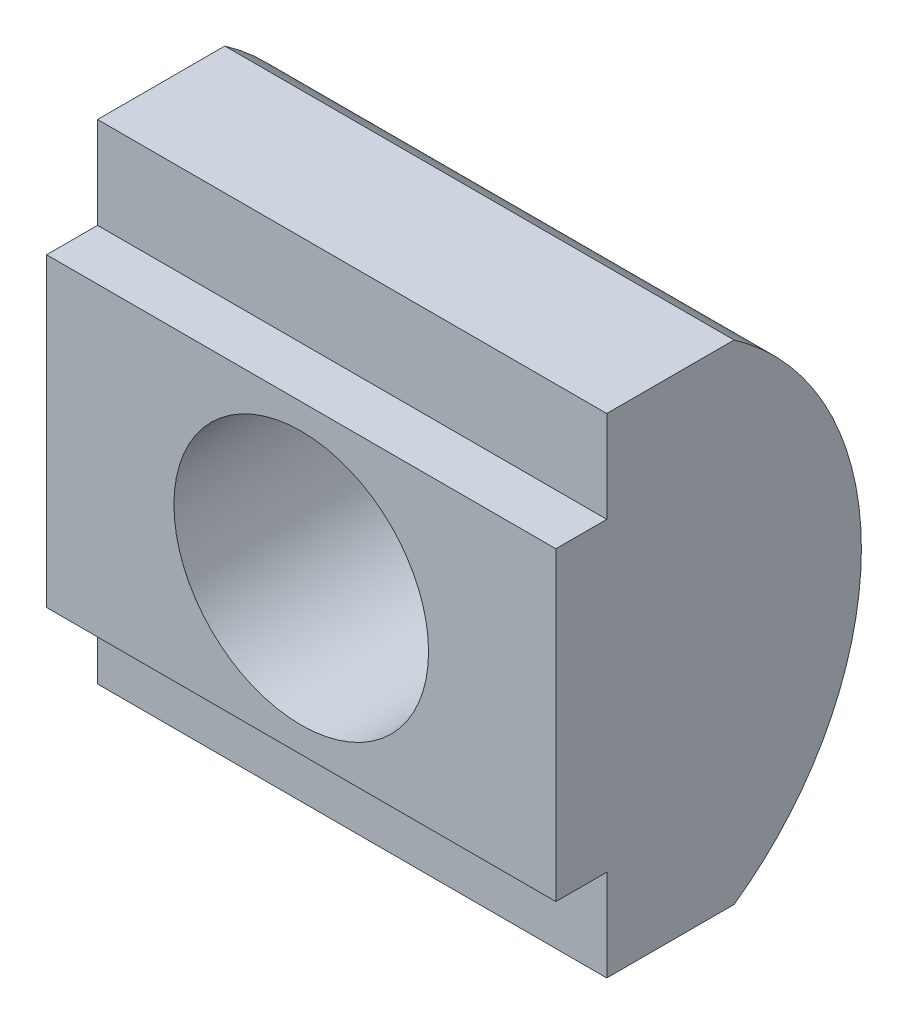
ISO-10303-21;
HEADER;
FILE_DESCRIPTION(('STEP AP214'),'2;1');
FILE_NAME('part.step','',(''),(''),'','','');
FILE_SCHEMA(('AUTOMOTIVE_DESIGN { 1 0 10303 214 1 1 1 1 }'));
ENDSEC;
DATA;
#1=APPLICATION_CONTEXT('core data for automotive mechanical design processes');
#2=APPLICATION_PROTOCOL_DEFINITION('international standard','automotive_design',2000,#1);
#3=PRODUCT_CONTEXT('',#1,'mechanical');
#4=PRODUCT('Part','Part','',(#3));
#5=PRODUCT_RELATED_PRODUCT_CATEGORY('part','',(#4));
#6=PRODUCT_DEFINITION_FORMATION('','',#4);
#7=PRODUCT_DEFINITION_CONTEXT('part definition',#1,'design');
#8=PRODUCT_DEFINITION('design','',#6,#7);
#9=PRODUCT_DEFINITION_SHAPE('','',#8);
#10=(LENGTH_UNIT() NAMED_UNIT(*) SI_UNIT(.MILLI.,.METRE.));
#11=(NAMED_UNIT(*) PLANE_ANGLE_UNIT() SI_UNIT($,.RADIAN.));
#12=(NAMED_UNIT(*) SI_UNIT($,.STERADIAN.) SOLID_ANGLE_UNIT());
#13=UNCERTAINTY_MEASURE_WITH_UNIT(LENGTH_MEASURE(1.E-05),#10,'distance_accuracy_value','');
#14=(GEOMETRIC_REPRESENTATION_CONTEXT(3) GLOBAL_UNCERTAINTY_ASSIGNED_CONTEXT((#13)) GLOBAL_UNIT_ASSIGNED_CONTEXT((#10,
#11,#12)) REPRESENTATION_CONTEXT('',''));
#15=CARTESIAN_POINT('',(0.,0.,0.));
#16=DIRECTION('',(0.,0.,1.));
#17=DIRECTION('',(1.,0.,0.));
#18=AXIS2_PLACEMENT_3D('',#15,#16,#17);
#19=CARTESIAN_POINT('',(0.,0.,6.));
#20=DIRECTION('',(0.,0.,1.));
#21=DIRECTION('',(1.,0.,0.));
#22=AXIS2_PLACEMENT_3D('',#19,#20,#21);
#23=PLANE('',#22);
#24=DIRECTION('',(0.,-1.,0.));
#25=VECTOR('',#24,1.);
#26=CARTESIAN_POINT('',(-5.,3.,6.));
#27=LINE('',#26,#25);
#28=CARTESIAN_POINT('',(-5.,3.,6.));
#29=VERTEX_POINT('',#28);
#30=CARTESIAN_POINT('',(-5.,-3.,6.));
#31=VERTEX_POINT('',#30);
#32=EDGE_CURVE('E150',#29,#31,#27,.T.);
#33=ORIENTED_EDGE('',*,*,#32,.T.);
#34=DIRECTION('',(1.,0.,0.));
#35=VECTOR('',#34,1.);
#36=CARTESIAN_POINT('',(-5.,-3.,6.));
#37=LINE('',#36,#35);
#38=CARTESIAN_POINT('',(5.,-3.,6.));
#39=VERTEX_POINT('',#38);
#40=EDGE_CURVE('E153',#31,#39,#37,.T.);
#41=ORIENTED_EDGE('',*,*,#40,.T.);
#42=DIRECTION('',(0.,1.,0.));
#43=VECTOR('',#42,1.);
#44=CARTESIAN_POINT('',(5.,3.,6.));
#45=LINE('',#44,#43);
#46=CARTESIAN_POINT('',(5.,3.,6.));
#47=VERTEX_POINT('',#46);
#48=EDGE_CURVE('E155',#39,#47,#45,.T.);
#49=ORIENTED_EDGE('',*,*,#48,.T.);
#50=DIRECTION('',(-1.,0.,0.));
#51=VECTOR('',#50,1.);
#52=CARTESIAN_POINT('',(-5.,3.,6.));
#53=LINE('',#52,#51);
#54=EDGE_CURVE('E157',#47,#29,#53,.T.);
#55=ORIENTED_EDGE('',*,*,#54,.T.);
#56=EDGE_LOOP('',(#33,#41,#49,#55));
#57=FACE_BOUND('',#56,.T.);
#58=CARTESIAN_POINT('',(0.,0.,6.));
#59=DIRECTION('',(0.,0.,1.));
#60=DIRECTION('',(1.,0.,0.));
#61=AXIS2_PLACEMENT_3D('',#58,#59,#60);
#62=CIRCLE('',#61,2.5);
#63=CARTESIAN_POINT('',(2.5,0.,6.));
#64=VERTEX_POINT('',#63);
#65=EDGE_CURVE('E147',#64,#64,#62,.T.);
#66=ORIENTED_EDGE('',*,*,#65,.F.);
#67=EDGE_LOOP('',(#66));
#68=FACE_BOUND('',#67,.T.);
#69=ADVANCED_FACE('F55',(#57,#68),#23,.T.);
#70=CARTESIAN_POINT('',(-5.,3.,6.));
#71=DIRECTION('',(1.,0.,0.));
#72=DIRECTION('',(0.,1.,0.));
#73=AXIS2_PLACEMENT_3D('',#70,#71,#72);
#74=PLANE('',#73);
#75=CARTESIAN_POINT('',(-5.,0.,5.858));
#76=DIRECTION('',(1.,0.,0.));
#77=DIRECTION('',(0.,1.,0.));
#78=AXIS2_PLACEMENT_3D('',#75,#76,#77);
#79=CIRCLE('',#78,5.858);
#80=CARTESIAN_POINT('',(-5.,4.8,2.5));
#81=VERTEX_POINT('',#80);
#82=CARTESIAN_POINT('',(-5.,-4.8,2.5));
#83=VERTEX_POINT('',#82);
#84=EDGE_CURVE('E69',#81,#83,#79,.F.);
#85=ORIENTED_EDGE('',*,*,#84,.T.);
#86=DIRECTION('',(0.,0.,-1.));
#87=VECTOR('',#86,1.);
#88=CARTESIAN_POINT('',(-5.,-4.8,5.));
#89=LINE('',#88,#87);
#90=CARTESIAN_POINT('',(-5.,-4.8,5.));
#91=VERTEX_POINT('',#90);
#92=EDGE_CURVE('E132',#91,#83,#89,.T.);
#93=ORIENTED_EDGE('',*,*,#92,.F.);
#94=DIRECTION('',(0.,1.,0.));
#95=VECTOR('',#94,1.);
#96=CARTESIAN_POINT('',(-5.,0.,5.));
#97=LINE('',#96,#95);
#98=CARTESIAN_POINT('',(-5.,-3.,5.));
#99=VERTEX_POINT('',#98);
#100=EDGE_CURVE('E184',#91,#99,#97,.T.);
#101=ORIENTED_EDGE('',*,*,#100,.T.);
#102=DIRECTION('',(0.,0.,-1.));
#103=VECTOR('',#102,1.);
#104=CARTESIAN_POINT('',(-5.,-3.,6.));
#105=LINE('',#104,#103);
#106=EDGE_CURVE('E77',#31,#99,#105,.T.);
#107=ORIENTED_EDGE('',*,*,#106,.F.);
#108=ORIENTED_EDGE('',*,*,#32,.F.);
#109=DIRECTION('',(0.,0.,-1.));
#110=VECTOR('',#109,1.);
#111=CARTESIAN_POINT('',(-5.,3.,6.));
#112=LINE('',#111,#110);
#113=CARTESIAN_POINT('',(-5.,3.,5.));
#114=VERTEX_POINT('',#113);
#115=EDGE_CURVE('E159',#29,#114,#112,.T.);
#116=ORIENTED_EDGE('',*,*,#115,.T.);
#117=CARTESIAN_POINT('',(-5.,4.8,5.));
#118=VERTEX_POINT('',#117);
#119=EDGE_CURVE('E183',#114,#118,#97,.T.);
#120=ORIENTED_EDGE('',*,*,#119,.T.);
#121=DIRECTION('',(0.,0.,-1.));
#122=VECTOR('',#121,1.);
#123=CARTESIAN_POINT('',(-5.,4.8,5.));
#124=LINE('',#123,#122);
#125=EDGE_CURVE('E142',#118,#81,#124,.T.);
#126=ORIENTED_EDGE('',*,*,#125,.T.);
#127=EDGE_LOOP('',(#85,#93,#101,#107,#108,#116,#120,#126));
#128=FACE_BOUND('',#127,.T.);
#129=ADVANCED_FACE('F57',(#128),#74,.F.);
#130=CARTESIAN_POINT('',(-5.,-3.,6.));
#131=DIRECTION('',(0.,1.,0.));
#132=DIRECTION('',(0.,0.,1.));
#133=AXIS2_PLACEMENT_3D('',#130,#131,#132);
#134=PLANE('',#133);
#135=ORIENTED_EDGE('',*,*,#106,.T.);
#136=DIRECTION('',(1.,0.,0.));
#137=VECTOR('',#136,1.);
#138=CARTESIAN_POINT('',(-5.,-3.,5.));
#139=LINE('',#138,#137);
#140=CARTESIAN_POINT('',(5.,-3.,5.));
#141=VERTEX_POINT('',#140);
#142=EDGE_CURVE('E140',#99,#141,#139,.T.);
#143=ORIENTED_EDGE('',*,*,#142,.T.);
#144=DIRECTION('',(0.,0.,-1.));
#145=VECTOR('',#144,1.);
#146=CARTESIAN_POINT('',(5.,-3.,6.));
#147=LINE('',#146,#145);
#148=EDGE_CURVE('E164',#39,#141,#147,.T.);
#149=ORIENTED_EDGE('',*,*,#148,.F.);
#150=ORIENTED_EDGE('',*,*,#40,.F.);
#151=EDGE_LOOP('',(#135,#143,#149,#150));
#152=FACE_BOUND('',#151,.T.);
#153=ADVANCED_FACE('F204',(#152),#134,.F.);
#154=CARTESIAN_POINT('',(5.,3.,6.));
#155=DIRECTION('',(-1.,0.,0.));
#156=DIRECTION('',(0.,0.,1.));
#157=AXIS2_PLACEMENT_3D('',#154,#155,#156);
#158=PLANE('',#157);
#159=DIRECTION('',(0.,0.,-1.));
#160=VECTOR('',#159,1.);
#161=CARTESIAN_POINT('',(5.,-4.8,5.));
#162=LINE('',#161,#160);
#163=CARTESIAN_POINT('',(5.,-4.8,5.));
#164=VERTEX_POINT('',#163);
#165=CARTESIAN_POINT('',(5.,-4.8,2.5));
#166=VERTEX_POINT('',#165);
#167=EDGE_CURVE('E130',#164,#166,#162,.T.);
#168=ORIENTED_EDGE('',*,*,#167,.T.);
#169=CARTESIAN_POINT('',(5.,0.,5.858));
#170=DIRECTION('',(1.,0.,0.));
#171=DIRECTION('',(0.,0.,-1.));
#172=AXIS2_PLACEMENT_3D('',#169,#170,#171);
#173=CIRCLE('',#172,5.858);
#174=CARTESIAN_POINT('',(5.,4.8,2.5));
#175=VERTEX_POINT('',#174);
#176=EDGE_CURVE('E117',#175,#166,#173,.F.);
#177=ORIENTED_EDGE('',*,*,#176,.F.);
#178=DIRECTION('',(0.,0.,-1.));
#179=VECTOR('',#178,1.);
#180=CARTESIAN_POINT('',(5.,4.8,5.));
#181=LINE('',#180,#179);
#182=CARTESIAN_POINT('',(5.,4.8,5.));
#183=VERTEX_POINT('',#182);
#184=EDGE_CURVE('E138',#183,#175,#181,.T.);
#185=ORIENTED_EDGE('',*,*,#184,.F.);
#186=DIRECTION('',(0.,-1.,0.));
#187=VECTOR('',#186,1.);
#188=CARTESIAN_POINT('',(5.,0.,5.));
#189=LINE('',#188,#187);
#190=CARTESIAN_POINT('',(5.,3.,5.));
#191=VERTEX_POINT('',#190);
#192=EDGE_CURVE('E174',#183,#191,#189,.T.);
#193=ORIENTED_EDGE('',*,*,#192,.T.);
#194=DIRECTION('',(0.,0.,-1.));
#195=VECTOR('',#194,1.);
#196=CARTESIAN_POINT('',(5.,3.,6.));
#197=LINE('',#196,#195);
#198=EDGE_CURVE('E162',#47,#191,#197,.T.);
#199=ORIENTED_EDGE('',*,*,#198,.F.);
#200=ORIENTED_EDGE('',*,*,#48,.F.);
#201=ORIENTED_EDGE('',*,*,#148,.T.);
#202=EDGE_CURVE('E136',#141,#164,#189,.T.);
#203=ORIENTED_EDGE('',*,*,#202,.T.);
#204=EDGE_LOOP('',(#168,#177,#185,#193,#199,#200,#201,#203));
#205=FACE_BOUND('',#204,.T.);
#206=ADVANCED_FACE('F133',(#205),#158,.F.);
#207=CARTESIAN_POINT('',(-5.,3.,6.));
#208=DIRECTION('',(0.,-1.,0.));
#209=DIRECTION('',(0.,0.,-1.));
#210=AXIS2_PLACEMENT_3D('',#207,#208,#209);
#211=PLANE('',#210);
#212=ORIENTED_EDGE('',*,*,#198,.T.);
#213=DIRECTION('',(-1.,0.,0.));
#214=VECTOR('',#213,1.);
#215=CARTESIAN_POINT('',(-5.,3.,5.));
#216=LINE('',#215,#214);
#217=EDGE_CURVE('E137',#191,#114,#216,.T.);
#218=ORIENTED_EDGE('',*,*,#217,.T.);
#219=ORIENTED_EDGE('',*,*,#115,.F.);
#220=ORIENTED_EDGE('',*,*,#54,.F.);
#221=EDGE_LOOP('',(#212,#218,#219,#220));
#222=FACE_BOUND('',#221,.T.);
#223=ADVANCED_FACE('F200',(#222),#211,.F.);
#224=CARTESIAN_POINT('',(0.,0.,6.));
#225=DIRECTION('',(0.,0.,-1.));
#226=DIRECTION('',(-1.,0.,0.));
#227=AXIS2_PLACEMENT_3D('',#224,#225,#226);
#228=CYLINDRICAL_SURFACE('',#227,2.5);
#229=CARTESIAN_POINT('',(2.5,0.,0.));
#230=CARTESIAN_POINT('',(2.49999226891897,0.133769590592561,6.33309348764583E-06));
#231=CARTESIAN_POINT('',(2.48921040204641,0.267646119435222,0.00462972999773145));
#232=CARTESIAN_POINT('',(2.44651731250022,0.531473421718521,0.0226550232713088));
#233=CARTESIAN_POINT('',(2.41457798617684,0.66141873289394,0.036068595457445));
#234=CARTESIAN_POINT('',(2.33097269584374,0.913303109792216,0.0702411748851231));
#235=CARTESIAN_POINT('',(2.27936589854452,1.03526491562983,0.0909781371895428));
#236=CARTESIAN_POINT('',(2.15816326338216,1.26871749269969,0.137797608723039));
#237=CARTESIAN_POINT('',(2.08856693101385,1.38020797597622,0.16388026489309));
#238=CARTESIAN_POINT('',(1.92955041696239,1.59548885233873,0.220310015359071));
#239=CARTESIAN_POINT('',(1.83934509617504,1.69866120250364,0.250800893517617));
#240=CARTESIAN_POINT('',(1.64333899202573,1.88894406473069,0.312004744966457));
#241=CARTESIAN_POINT('',(1.5375307347188,1.97604683405891,0.342717817948039));
#242=CARTESIAN_POINT('',(1.30662594229164,2.1362302596318,0.402691802388866));
#243=CARTESIAN_POINT('',(1.18081060163572,2.20834086839485,0.431793071224925));
#244=CARTESIAN_POINT('',(0.917416421725208,2.33009976548839,0.48294716046247));
#245=CARTESIAN_POINT('',(0.779843847528991,2.37975992930223,0.50500370545463));
#246=CARTESIAN_POINT('',(0.503973372943743,2.45261704407835,0.538002758025369));
#247=CARTESIAN_POINT('',(0.366053257516594,2.47700941679478,0.549444339014589));
#248=CARTESIAN_POINT('',(0.087639655965606,2.50236431596591,0.561344998093812));
#249=CARTESIAN_POINT('',(-0.052852262626441,2.50334066808485,0.561810556821006));
#250=CARTESIAN_POINT('',(-0.320237755140127,2.48273277815359,0.552126730619594));
#251=CARTESIAN_POINT('',(-0.447309446878974,2.46297339331316,0.542835915199154));
#252=CARTESIAN_POINT('',(-0.696123107741858,2.40452719690571,0.516143204603337));
#253=CARTESIAN_POINT('',(-0.817863987936493,2.3658365377004,0.498739660611283));
#254=CARTESIAN_POINT('',(-1.05571254297444,2.26986395073076,0.457384064153055));
#255=CARTESIAN_POINT('',(-1.17163992402692,2.21219568673912,0.433297718947962));
#256=CARTESIAN_POINT('',(-1.39263353804417,2.08018146604606,0.381319140708083));
#257=CARTESIAN_POINT('',(-1.49769573417448,2.00582934293846,0.353425501982769));
#258=CARTESIAN_POINT('',(-1.70381936436279,1.83479956470367,0.293957486735896));
#259=CARTESIAN_POINT('',(-1.80369366013971,1.7367243320631,0.262276406346982));
#260=CARTESIAN_POINT('',(-1.98601384889334,1.52488830550964,0.200877775450936));
#261=CARTESIAN_POINT('',(-2.06845070852074,1.41111943178076,0.171161248120619));
#262=CARTESIAN_POINT('',(-2.21542548018991,1.16733318614133,0.116092197477942));
#263=CARTESIAN_POINT('',(-2.27944485152977,1.03697145498243,0.0908725450760884));
#264=CARTESIAN_POINT('',(-2.3841345128894,0.766089221843618,0.0487019019403349));
#265=CARTESIAN_POINT('',(-2.42485114875752,0.625589514346765,0.0317345087998245));
#266=CARTESIAN_POINT('',(-2.4686132987626,0.403108050512981,0.013340910129257));
#267=CARTESIAN_POINT('',(-2.48036211179295,0.323034394108902,0.00835807333849965));
#268=CARTESIAN_POINT('',(-2.49605772152976,0.161986886467025,0.0016857351393679));
#269=CARTESIAN_POINT('',(-2.50000468206925,0.0810130541681514,-3.83542510180919E-06));
#270=CARTESIAN_POINT('',(-2.49999226891897,-0.133769590592561,6.33309348731454E-06));
#271=CARTESIAN_POINT('',(-2.48921040204641,-0.267646119435222,0.00462972999773117));
#272=CARTESIAN_POINT('',(-2.44651731250022,-0.531473421718521,0.0226550232713087));
#273=CARTESIAN_POINT('',(-2.41457798617684,-0.66141873289394,0.0360685954574449));
#274=CARTESIAN_POINT('',(-2.33097269584374,-0.913303109792216,0.0702411748851232));
#275=CARTESIAN_POINT('',(-2.27936589854452,-1.03526491562983,0.0909781371895429));
#276=CARTESIAN_POINT('',(-2.15816326338216,-1.26871749269969,0.137797608723039));
#277=CARTESIAN_POINT('',(-2.08856693101385,-1.38020797597622,0.16388026489309));
#278=CARTESIAN_POINT('',(-1.92955041696239,-1.59548885233873,0.220310015359071));
#279=CARTESIAN_POINT('',(-1.83934509617504,-1.69866120250364,0.250800893517617));
#280=CARTESIAN_POINT('',(-1.64333899202573,-1.88894406473069,0.312004744966457));
#281=CARTESIAN_POINT('',(-1.5375307347188,-1.97604683405891,0.342717817948039));
#282=CARTESIAN_POINT('',(-1.30662594229164,-2.1362302596318,0.402691802388866));
#283=CARTESIAN_POINT('',(-1.18081060163572,-2.20834086839485,0.431793071224925));
#284=CARTESIAN_POINT('',(-0.917416421725207,-2.33009976548839,0.482947160462471));
#285=CARTESIAN_POINT('',(-0.77984384752899,-2.37975992930223,0.505003705454631));
#286=CARTESIAN_POINT('',(-0.503973372943743,-2.45261704407835,0.538002758025369));
#287=CARTESIAN_POINT('',(-0.366053257516594,-2.47700941679478,0.549444339014588));
#288=CARTESIAN_POINT('',(-0.0876396559656066,-2.50236431596591,0.561344998093812));
#289=CARTESIAN_POINT('',(0.0528522626264408,-2.50334066808485,0.561810556821006));
#290=CARTESIAN_POINT('',(0.320237755140128,-2.48273277815359,0.552126730619594));
#291=CARTESIAN_POINT('',(0.447309446878974,-2.46297339331316,0.542835915199153));
#292=CARTESIAN_POINT('',(0.696123107741858,-2.40452719690571,0.516143204603337));
#293=CARTESIAN_POINT('',(0.817863987936493,-2.3658365377004,0.498739660611283));
#294=CARTESIAN_POINT('',(1.05571254297444,-2.26986395073076,0.457384064153055));
#295=CARTESIAN_POINT('',(1.17163992402692,-2.21219568673912,0.433297718947962));
#296=CARTESIAN_POINT('',(1.39263353804417,-2.08018146604606,0.381319140708083));
#297=CARTESIAN_POINT('',(1.49769573417448,-2.00582934293846,0.353425501982769));
#298=CARTESIAN_POINT('',(1.70381936436279,-1.83479956470367,0.293957486735896));
#299=CARTESIAN_POINT('',(1.80369366013971,-1.7367243320631,0.262276406346982));
#300=CARTESIAN_POINT('',(1.98601384889334,-1.52488830550964,0.200877775450936));
#301=CARTESIAN_POINT('',(2.06845070852074,-1.41111943178076,0.171161248120619));
#302=CARTESIAN_POINT('',(2.21542548018991,-1.16733318614133,0.116092197477942));
#303=CARTESIAN_POINT('',(2.27944485152977,-1.03697145498243,0.0908725450760883));
#304=CARTESIAN_POINT('',(2.3841345128894,-0.766089221843618,0.0487019019403348));
#305=CARTESIAN_POINT('',(2.42485114875752,-0.625589514346765,0.0317345087998244));
#306=CARTESIAN_POINT('',(2.4686132987626,-0.403108050512981,0.0133409101292571));
#307=CARTESIAN_POINT('',(2.48036211179295,-0.323034394108902,0.00835807333849975));
#308=CARTESIAN_POINT('',(2.49605772152976,-0.161986886467025,0.00168573513936812));
#309=CARTESIAN_POINT('',(2.50000468206925,-0.0810130541681514,-3.83542510153167E-06));
#310=CARTESIAN_POINT('',(2.5,0.,0.));
#311=B_SPLINE_CURVE_WITH_KNOTS('',3,(#229,#230,#231,#232,#233,#234,#235,#236,#237,#238,#239,
#240,#241,#242,#243,#244,#245,#246,#247,#248,#249,#250,#251,#252,#253,#254,#255,#256,#257,#258,
#259,#260,#261,#262,#263,#264,#265,#266,#267,#268,#269,#270,#271,#272,#273,#274,#275,#276,#277,
#278,#279,#280,#281,#282,#283,#284,#285,#286,#287,#288,#289,#290,#291,#292,#293,#294,#295,#296,
#297,#298,#299,#300,#301,#302,#303,#304,#305,#306,#307,#308,#309,#310),.UNSPECIFIED.,.T.,.F.,(4,
2,2,2,2,2,2,2,2,2,2,2,2,2,2,2,2,2,2,2,2,2,2,2,2,2,2,2,2,2,2,2,2,2,2,2,2,2,2,2,4),(0.,
0.400993369649232,0.802520453452138,1.20284901700309,1.6031885861526,2.02256043816815,
2.44213382950503,2.88362260103981,3.32487756675244,3.74414341350149,4.16316170445439,
4.54816741014675,4.93325139785931,5.32671732213398,5.72032891287846,6.14895238697358,
6.57779736576116,7.01774282287624,7.45681022246586,7.69966347206666,7.94251162187829,
8.34350499152752,8.74503207533042,9.14536063888137,9.54570020803089,9.96507206004644,
10.3846454513833,10.8261342229181,11.2673891886307,11.6866550353798,12.1056733263327,
12.490679032025,12.8757630197376,13.2692289440123,13.6628405347567,14.0914640088519,
14.5203089876394,14.9602544447545,15.3993218443441,15.6421750939449,15.8850232437566),.UNSPECIFIED.);
#312=CARTESIAN_POINT('',(2.5,0.,0.));
#313=VERTEX_POINT('',#312);
#314=EDGE_CURVE('E124',#313,#313,#311,.T.);
#315=ORIENTED_EDGE('',*,*,#314,.F.);
#316=EDGE_LOOP('',(#315));
#317=FACE_BOUND('',#316,.T.);
#318=ORIENTED_EDGE('',*,*,#65,.T.);
#319=EDGE_LOOP('',(#318));
#320=FACE_BOUND('',#319,.T.);
#321=ADVANCED_FACE('F217',(#317,#320),#228,.F.);
#322=CARTESIAN_POINT('',(0.,4.8,5.));
#323=DIRECTION('',(0.,1.,0.));
#324=DIRECTION('',(0.,0.,1.));
#325=AXIS2_PLACEMENT_3D('',#322,#323,#324);
#326=PLANE('',#325);
#327=DIRECTION('',(1.,0.,0.));
#328=VECTOR('',#327,1.);
#329=CARTESIAN_POINT('',(-10.,4.8,2.5));
#330=LINE('',#329,#328);
#331=EDGE_CURVE('E63',#81,#175,#330,.T.);
#332=ORIENTED_EDGE('',*,*,#331,.F.);
#333=ORIENTED_EDGE('',*,*,#125,.F.);
#334=DIRECTION('',(1.,0.,0.));
#335=VECTOR('',#334,1.);
#336=CARTESIAN_POINT('',(0.,4.8,5.));
#337=LINE('',#336,#335);
#338=EDGE_CURVE('E177',#118,#183,#337,.T.);
#339=ORIENTED_EDGE('',*,*,#338,.T.);
#340=ORIENTED_EDGE('',*,*,#184,.T.);
#341=EDGE_LOOP('',(#332,#333,#339,#340));
#342=FACE_BOUND('',#341,.T.);
#343=ADVANCED_FACE('F192',(#342),#326,.T.);
#344=CARTESIAN_POINT('',(0.,0.,5.));
#345=DIRECTION('',(0.,0.,1.));
#346=DIRECTION('',(1.,0.,0.));
#347=AXIS2_PLACEMENT_3D('',#344,#345,#346);
#348=PLANE('',#347);
#349=ORIENTED_EDGE('',*,*,#217,.F.);
#350=ORIENTED_EDGE('',*,*,#192,.F.);
#351=ORIENTED_EDGE('',*,*,#338,.F.);
#352=ORIENTED_EDGE('',*,*,#119,.F.);
#353=EDGE_LOOP('',(#349,#350,#351,#352));
#354=FACE_BOUND('',#353,.T.);
#355=ADVANCED_FACE('F196',(#354),#348,.T.);
#356=ORIENTED_EDGE('',*,*,#142,.F.);
#357=ORIENTED_EDGE('',*,*,#100,.F.);
#358=DIRECTION('',(-1.,0.,0.));
#359=VECTOR('',#358,1.);
#360=CARTESIAN_POINT('',(0.,-4.8,5.));
#361=LINE('',#360,#359);
#362=EDGE_CURVE('E173',#164,#91,#361,.T.);
#363=ORIENTED_EDGE('',*,*,#362,.F.);
#364=ORIENTED_EDGE('',*,*,#202,.F.);
#365=EDGE_LOOP('',(#356,#357,#363,#364));
#366=FACE_BOUND('',#365,.T.);
#367=ADVANCED_FACE('F170',(#366),#348,.T.);
#368=CARTESIAN_POINT('',(0.,-4.8,5.));
#369=DIRECTION('',(0.,-1.,0.));
#370=DIRECTION('',(1.,0.,0.));
#371=AXIS2_PLACEMENT_3D('',#368,#369,#370);
#372=PLANE('',#371);
#373=DIRECTION('',(1.,0.,0.));
#374=VECTOR('',#373,1.);
#375=CARTESIAN_POINT('',(-10.,-4.8,2.5));
#376=LINE('',#375,#374);
#377=EDGE_CURVE('E12',#166,#83,#376,.F.);
#378=ORIENTED_EDGE('',*,*,#377,.F.);
#379=ORIENTED_EDGE('',*,*,#167,.F.);
#380=ORIENTED_EDGE('',*,*,#362,.T.);
#381=ORIENTED_EDGE('',*,*,#92,.T.);
#382=EDGE_LOOP('',(#378,#379,#380,#381));
#383=FACE_BOUND('',#382,.T.);
#384=ADVANCED_FACE('F128',(#383),#372,.T.);
#385=CARTESIAN_POINT('',(-10.,0.,5.858));
#386=DIRECTION('',(1.,0.,0.));
#387=DIRECTION('',(0.,0.,-1.));
#388=AXIS2_PLACEMENT_3D('',#385,#386,#387);
#389=CYLINDRICAL_SURFACE('',#388,5.858);
#390=ORIENTED_EDGE('',*,*,#314,.T.);
#391=EDGE_LOOP('',(#390));
#392=FACE_BOUND('',#391,.T.);
#393=ORIENTED_EDGE('',*,*,#331,.T.);
#394=ORIENTED_EDGE('',*,*,#176,.T.);
#395=ORIENTED_EDGE('',*,*,#377,.T.);
#396=ORIENTED_EDGE('',*,*,#84,.F.);
#397=EDGE_LOOP('',(#393,#394,#395,#396));
#398=FACE_BOUND('',#397,.T.);
#399=ADVANCED_FACE('F119',(#392,#398),#389,.T.);
#400=CLOSED_SHELL('',(#69,#129,#153,#206,#223,#321,#343,#355,#367,#384,#399));
#401=MANIFOLD_SOLID_BREP('B2',#400);
#402=ADVANCED_BREP_SHAPE_REPRESENTATION('',(#18,#401),#14);
#403=SHAPE_DEFINITION_REPRESENTATION(#9,#402);
ENDSEC;
END-ISO-10303-21;
